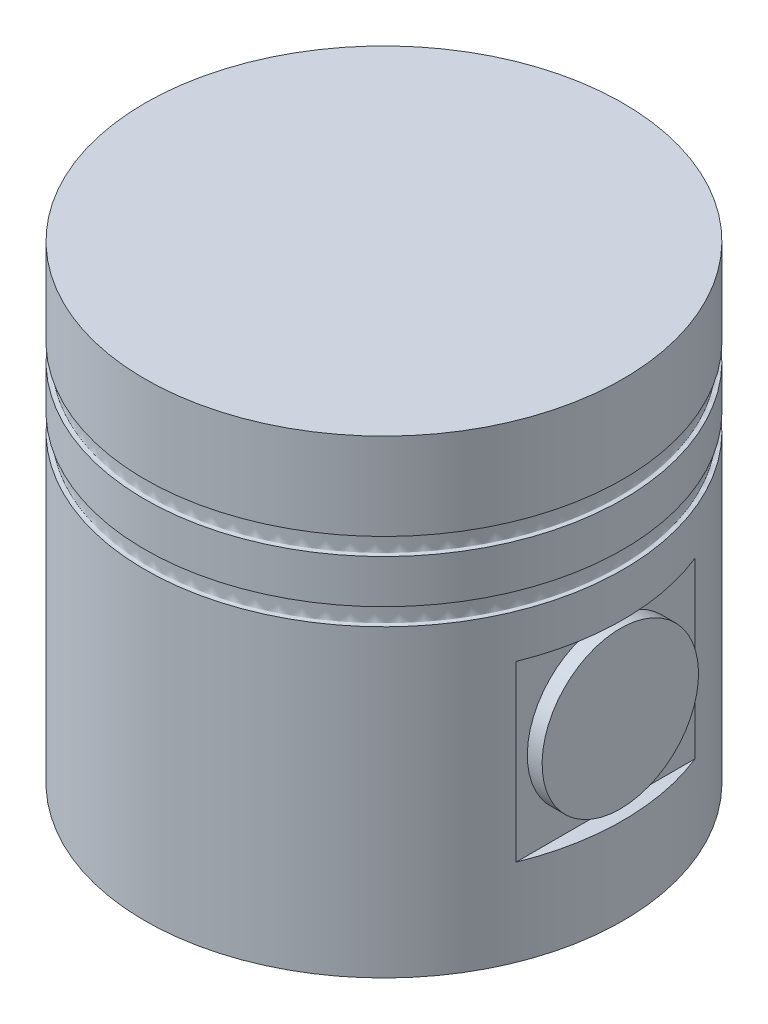
ISO-10303-21;
HEADER;
FILE_DESCRIPTION(('STEP AP214'),'2;1');
FILE_NAME('part.step','',(''),(''),'','','');
FILE_SCHEMA(('AUTOMOTIVE_DESIGN { 1 0 10303 214 1 1 1 1 }'));
ENDSEC;
DATA;
#1=APPLICATION_CONTEXT('core data for automotive mechanical design processes');
#2=APPLICATION_PROTOCOL_DEFINITION('international standard','automotive_design',2000,#1);
#3=PRODUCT_CONTEXT('',#1,'mechanical');
#4=PRODUCT('Part','Part','',(#3));
#5=PRODUCT_RELATED_PRODUCT_CATEGORY('part','',(#4));
#6=PRODUCT_DEFINITION_FORMATION('','',#4);
#7=PRODUCT_DEFINITION_CONTEXT('part definition',#1,'design');
#8=PRODUCT_DEFINITION('design','',#6,#7);
#9=PRODUCT_DEFINITION_SHAPE('','',#8);
#10=(LENGTH_UNIT() NAMED_UNIT(*) SI_UNIT(.MILLI.,.METRE.));
#11=(NAMED_UNIT(*) PLANE_ANGLE_UNIT() SI_UNIT($,.RADIAN.));
#12=(NAMED_UNIT(*) SI_UNIT($,.STERADIAN.) SOLID_ANGLE_UNIT());
#13=UNCERTAINTY_MEASURE_WITH_UNIT(LENGTH_MEASURE(1.E-05),#10,'distance_accuracy_value','');
#14=(GEOMETRIC_REPRESENTATION_CONTEXT(3) GLOBAL_UNCERTAINTY_ASSIGNED_CONTEXT((#13)) GLOBAL_UNIT_ASSIGNED_CONTEXT((#10,
#11,#12)) REPRESENTATION_CONTEXT('',''));
#15=CARTESIAN_POINT('',(0.,0.,0.));
#16=DIRECTION('',(0.,0.,1.));
#17=DIRECTION('',(1.,0.,0.));
#18=AXIS2_PLACEMENT_3D('',#15,#16,#17);
#19=CARTESIAN_POINT('',(27.2000000000001,20.,0.));
#20=DIRECTION('',(-1.,0.,0.));
#21=DIRECTION('',(0.,-1.,0.));
#22=AXIS2_PLACEMENT_3D('',#19,#20,#21);
#23=CYLINDRICAL_SURFACE('',#22,9.);
#24=CARTESIAN_POINT('',(27.2000000000001,20.,0.));
#25=DIRECTION('',(-1.,0.,0.));
#26=DIRECTION('',(0.,-1.,0.));
#27=AXIS2_PLACEMENT_3D('',#24,#25,#26);
#28=CIRCLE('',#27,9.);
#29=CARTESIAN_POINT('',(27.2000000000001,11.,0.));
#30=VERTEX_POINT('',#29);
#31=EDGE_CURVE('E11',#30,#30,#28,.T.);
#32=CARTESIAN_POINT('',(-27.1999999999999,20.,0.));
#33=DIRECTION('',(-1.,0.,0.));
#34=DIRECTION('',(0.,-1.,0.));
#35=AXIS2_PLACEMENT_3D('',#32,#33,#34);
#36=CIRCLE('',#35,9.);
#37=CARTESIAN_POINT('',(-27.1999999999999,11.,0.));
#38=VERTEX_POINT('',#37);
#39=EDGE_CURVE('E51',#38,#38,#36,.T.);
#40=CARTESIAN_POINT('',(27.2000000000001,11.,0.));
#41=CARTESIAN_POINT('',(26.6333333333335,11.,0.));
#42=CARTESIAN_POINT('',(26.0666666666668,11.,0.));
#43=CARTESIAN_POINT('',(24.9333333333335,11.,0.));
#44=CARTESIAN_POINT('',(24.3666666666668,11.,0.));
#45=CARTESIAN_POINT('',(23.2333333333335,11.,0.));
#46=CARTESIAN_POINT('',(22.6666666666668,11.,0.));
#47=CARTESIAN_POINT('',(21.5333333333335,11.,0.));
#48=CARTESIAN_POINT('',(20.9666666666668,11.,0.));
#49=CARTESIAN_POINT('',(19.8333333333335,11.,0.));
#50=CARTESIAN_POINT('',(19.2666666666668,11.,0.));
#51=CARTESIAN_POINT('',(18.1333333333335,11.,0.));
#52=CARTESIAN_POINT('',(17.5666666666668,11.,0.));
#53=CARTESIAN_POINT('',(16.4333333333335,11.,0.));
#54=CARTESIAN_POINT('',(15.8666666666668,11.,0.));
#55=CARTESIAN_POINT('',(14.7333333333335,11.,0.));
#56=CARTESIAN_POINT('',(14.1666666666668,11.,0.));
#57=CARTESIAN_POINT('',(13.0333333333335,11.,0.));
#58=CARTESIAN_POINT('',(12.4666666666668,11.,0.));
#59=CARTESIAN_POINT('',(11.3333333333335,11.,0.));
#60=CARTESIAN_POINT('',(10.7666666666668,11.,0.));
#61=CARTESIAN_POINT('',(9.63333333333347,11.,0.));
#62=CARTESIAN_POINT('',(9.0666666666668,11.,0.));
#63=CARTESIAN_POINT('',(7.93333333333347,11.,0.));
#64=CARTESIAN_POINT('',(7.3666666666668,11.,0.));
#65=CARTESIAN_POINT('',(6.23333333333347,11.,0.));
#66=CARTESIAN_POINT('',(5.6666666666668,11.,0.));
#67=CARTESIAN_POINT('',(4.53333333333347,11.,0.));
#68=CARTESIAN_POINT('',(3.9666666666668,11.,0.));
#69=CARTESIAN_POINT('',(2.83333333333347,11.,0.));
#70=CARTESIAN_POINT('',(2.2666666666668,11.,0.));
#71=CARTESIAN_POINT('',(1.13333333333347,11.,0.));
#72=CARTESIAN_POINT('',(0.566666666666802,11.,0.));
#73=CARTESIAN_POINT('',(-0.566666666666531,11.,0.));
#74=CARTESIAN_POINT('',(-1.1333333333332,11.,0.));
#75=CARTESIAN_POINT('',(-2.26666666666653,11.,0.));
#76=CARTESIAN_POINT('',(-2.8333333333332,11.,0.));
#77=CARTESIAN_POINT('',(-3.96666666666653,11.,0.));
#78=CARTESIAN_POINT('',(-4.5333333333332,11.,0.));
#79=CARTESIAN_POINT('',(-5.66666666666653,11.,0.));
#80=CARTESIAN_POINT('',(-6.23333333333319,11.,0.));
#81=CARTESIAN_POINT('',(-7.36666666666653,11.,0.));
#82=CARTESIAN_POINT('',(-7.9333333333332,11.,0.));
#83=CARTESIAN_POINT('',(-9.06666666666653,11.,0.));
#84=CARTESIAN_POINT('',(-9.6333333333332,11.,0.));
#85=CARTESIAN_POINT('',(-10.7666666666665,11.,0.));
#86=CARTESIAN_POINT('',(-11.3333333333332,11.,0.));
#87=CARTESIAN_POINT('',(-12.4666666666665,11.,0.));
#88=CARTESIAN_POINT('',(-13.0333333333332,11.,0.));
#89=CARTESIAN_POINT('',(-14.1666666666665,11.,0.));
#90=CARTESIAN_POINT('',(-14.7333333333332,11.,0.));
#91=CARTESIAN_POINT('',(-15.8666666666665,11.,0.));
#92=CARTESIAN_POINT('',(-16.4333333333332,11.,0.));
#93=CARTESIAN_POINT('',(-17.5666666666665,11.,0.));
#94=CARTESIAN_POINT('',(-18.1333333333332,11.,0.));
#95=CARTESIAN_POINT('',(-19.2666666666665,11.,0.));
#96=CARTESIAN_POINT('',(-19.8333333333332,11.,0.));
#97=CARTESIAN_POINT('',(-20.9666666666665,11.,0.));
#98=CARTESIAN_POINT('',(-21.5333333333332,11.,0.));
#99=CARTESIAN_POINT('',(-22.6666666666665,11.,0.));
#100=CARTESIAN_POINT('',(-23.2333333333332,11.,0.));
#101=CARTESIAN_POINT('',(-24.3666666666665,11.,0.));
#102=CARTESIAN_POINT('',(-24.9333333333332,11.,0.));
#103=CARTESIAN_POINT('',(-26.0666666666665,11.,0.));
#104=CARTESIAN_POINT('',(-26.6333333333332,11.,0.));
#105=CARTESIAN_POINT('',(-27.1999999999999,11.,0.));
#106=B_SPLINE_CURVE_WITH_KNOTS('',3,(#40,#41,#42,#43,#44,#45,#46,#47,#48,#49,#50,#51,#52,#53,
#54,#55,#56,#57,#58,#59,#60,#61,#62,#63,#64,#65,#66,#67,#68,#69,#70,#71,#72,#73,#74,#75,#76,#77,
#78,#79,#80,#81,#82,#83,#84,#85,#86,#87,#88,#89,#90,#91,#92,#93,#94,#95,#96,#97,#98,#99,#100,
#101,#102,#103,#104,#105),.UNSPECIFIED.,.F.,.F.,(4,2,2,2,2,2,2,2,2,2,2,2,2,2,2,2,2,2,2,2,2,2,2,
2,2,2,2,2,2,2,2,2,4),(0.,1.7,3.4,5.1,6.8,8.5,10.2,11.9,13.6,15.3,17.,18.7,20.4,22.1,23.8,25.5,
27.2,28.9,30.6,32.3,34.,35.7,37.4,39.1,40.8,42.5,44.2,45.9,47.6,49.3,51.,52.7,54.4),.UNSPECIFIED.);
#107=EDGE_CURVE('BSEAM45',#30,#38,#106,.T.);
#108=ORIENTED_EDGE('',*,*,#31,.T.);
#109=ORIENTED_EDGE('',*,*,#39,.F.);
#110=ORIENTED_EDGE('',*,*,#107,.T.);
#111=ORIENTED_EDGE('',*,*,#107,.F.);
#112=EDGE_LOOP('',(#108,#110,#109,#111));
#113=FACE_BOUND('',#112,.T.);
#114=ADVANCED_FACE('F45',(#113),#23,.T.);
#115=CARTESIAN_POINT('',(27.2000000000001,20.,0.));
#116=DIRECTION('',(-1.,0.,0.));
#117=DIRECTION('',(0.,-1.,0.));
#118=AXIS2_PLACEMENT_3D('',#115,#116,#117);
#119=PLANE('',#118);
#120=ORIENTED_EDGE('',*,*,#31,.F.);
#121=EDGE_LOOP('',(#120));
#122=FACE_BOUND('',#121,.T.);
#123=ADVANCED_FACE('F60',(#122),#119,.F.);
#124=CARTESIAN_POINT('',(-27.1999999999999,20.,0.));
#125=DIRECTION('',(-1.,0.,0.));
#126=DIRECTION('',(0.,-1.,0.));
#127=AXIS2_PLACEMENT_3D('',#124,#125,#126);
#128=PLANE('',#127);
#129=ORIENTED_EDGE('',*,*,#39,.T.);
#130=EDGE_LOOP('',(#129));
#131=FACE_BOUND('',#130,.T.);
#132=ADVANCED_FACE('F57',(#131),#128,.T.);
#133=CLOSED_SHELL('',(#114,#123,#132));
#134=MANIFOLD_SOLID_BREP('B2',#133);
#135=CARTESIAN_POINT('',(0.,54.,0.));
#136=DIRECTION('',(0.,1.,0.));
#137=DIRECTION('',(-1.,0.,0.));
#138=AXIS2_PLACEMENT_3D('',#135,#136,#137);
#139=CYLINDRICAL_SURFACE('',#138,27.4999999999999);
#140=CARTESIAN_POINT('',(1.20574084721109E-13,9.99999999999984,0.));
#141=DIRECTION('',(0.,-1.,0.));
#142=DIRECTION('',(0.,0.,-1.));
#143=AXIS2_PLACEMENT_3D('',#140,#141,#142);
#144=CIRCLE('',#143,27.4999999999999);
#145=CARTESIAN_POINT('',(25.5,9.99999999999984,-10.2956301409871));
#146=VERTEX_POINT('',#145);
#147=CARTESIAN_POINT('',(25.4999999999999,9.99999999999984,10.2956301409871));
#148=VERTEX_POINT('',#147);
#149=EDGE_CURVE('E133',#146,#148,#144,.T.);
#150=ORIENTED_EDGE('',*,*,#149,.T.);
#151=DIRECTION('',(0.,1.,0.));
#152=VECTOR('',#151,1.);
#153=CARTESIAN_POINT('',(25.4999999999998,54.,10.2956301409871));
#154=LINE('',#153,#152);
#155=CARTESIAN_POINT('',(25.4999999999999,30.,10.2956301409871));
#156=VERTEX_POINT('',#155);
#157=EDGE_CURVE('E43',#148,#156,#154,.T.);
#158=ORIENTED_EDGE('',*,*,#157,.T.);
#159=CARTESIAN_POINT('',(0.,30.,0.));
#160=DIRECTION('',(0.,1.,0.));
#161=DIRECTION('',(0.,0.,1.));
#162=AXIS2_PLACEMENT_3D('',#159,#160,#161);
#163=CIRCLE('',#162,27.4999999999999);
#164=CARTESIAN_POINT('',(25.4999999999999,30.,-10.2956301409871));
#165=VERTEX_POINT('',#164);
#166=EDGE_CURVE('E99',#156,#165,#163,.T.);
#167=ORIENTED_EDGE('',*,*,#166,.T.);
#168=DIRECTION('',(0.,1.,0.));
#169=VECTOR('',#168,1.);
#170=CARTESIAN_POINT('',(25.4999999999998,54.,-10.2956301409871));
#171=LINE('',#170,#169);
#172=EDGE_CURVE('E136',#165,#146,#171,.F.);
#173=ORIENTED_EDGE('',*,*,#172,.T.);
#174=EDGE_LOOP('',(#150,#158,#167,#173));
#175=FACE_BOUND('',#174,.T.);
#176=CARTESIAN_POINT('',(0.,34.9999999999999,0.));
#177=DIRECTION('',(0.,1.,0.));
#178=DIRECTION('',(-1.,0.,0.));
#179=AXIS2_PLACEMENT_3D('',#176,#177,#178);
#180=CIRCLE('',#179,27.4999999999999);
#181=CARTESIAN_POINT('',(-27.4999999999999,34.9999999999998,0.));
#182=VERTEX_POINT('',#181);
#183=EDGE_CURVE('E155',#182,#182,#180,.T.);
#184=ORIENTED_EDGE('',*,*,#183,.F.);
#185=EDGE_LOOP('',(#184));
#186=FACE_BOUND('',#185,.T.);
#187=CARTESIAN_POINT('',(1.49554307135885E-13,0.,0.));
#188=DIRECTION('',(0.,1.,0.));
#189=DIRECTION('',(-1.,0.,0.));
#190=AXIS2_PLACEMENT_3D('',#187,#188,#189);
#191=CIRCLE('',#190,27.4999999999999);
#192=CARTESIAN_POINT('',(-27.4999999999997,-1.56023444583614E-13,0.));
#193=VERTEX_POINT('',#192);
#194=EDGE_CURVE('E250',#193,#193,#191,.T.);
#195=ORIENTED_EDGE('',*,*,#194,.T.);
#196=EDGE_LOOP('',(#195));
#197=FACE_BOUND('',#196,.T.);
#198=CARTESIAN_POINT('',(1.20574084721109E-13,9.99999999999984,0.));
#199=DIRECTION('',(0.,1.,0.));
#200=DIRECTION('',(0.,0.,1.));
#201=AXIS2_PLACEMENT_3D('',#198,#199,#200);
#202=CIRCLE('',#201,27.4999999999999);
#203=CARTESIAN_POINT('',(-25.4999999999999,9.99999999999984,-10.2956301409868));
#204=VERTEX_POINT('',#203);
#205=CARTESIAN_POINT('',(-25.4999999999999,9.99999999999984,10.2956301409868));
#206=VERTEX_POINT('',#205);
#207=EDGE_CURVE('E257',#204,#206,#202,.T.);
#208=ORIENTED_EDGE('',*,*,#207,.F.);
#209=DIRECTION('',(0.,1.,0.));
#210=VECTOR('',#209,1.);
#211=CARTESIAN_POINT('',(-25.4999999999998,54.,-10.2956301409871));
#212=LINE('',#211,#210);
#213=CARTESIAN_POINT('',(-25.4999999999999,30.,-10.2956301409871));
#214=VERTEX_POINT('',#213);
#215=EDGE_CURVE('E268',#214,#204,#212,.F.);
#216=ORIENTED_EDGE('',*,*,#215,.F.);
#217=CARTESIAN_POINT('',(0.,30.,0.));
#218=DIRECTION('',(0.,-1.,0.));
#219=DIRECTION('',(0.,0.,-1.));
#220=AXIS2_PLACEMENT_3D('',#217,#218,#219);
#221=CIRCLE('',#220,27.4999999999999);
#222=CARTESIAN_POINT('',(-25.4999999999999,30.,10.2956301409871));
#223=VERTEX_POINT('',#222);
#224=EDGE_CURVE('E114',#223,#214,#221,.T.);
#225=ORIENTED_EDGE('',*,*,#224,.F.);
#226=DIRECTION('',(0.,1.,0.));
#227=VECTOR('',#226,1.);
#228=CARTESIAN_POINT('',(-25.4999999999998,54.,10.2956301409871));
#229=LINE('',#228,#227);
#230=EDGE_CURVE('E265',#206,#223,#229,.T.);
#231=ORIENTED_EDGE('',*,*,#230,.F.);
#232=EDGE_LOOP('',(#208,#216,#225,#231));
#233=FACE_BOUND('',#232,.T.);
#234=ADVANCED_FACE('F92',(#175,#186,#197,#233),#139,.T.);
#235=CARTESIAN_POINT('',(25.,0.,0.));
#236=DIRECTION('',(0.,1.,0.));
#237=DIRECTION('',(-1.,0.,0.));
#238=AXIS2_PLACEMENT_3D('',#235,#236,#237);
#239=PLANE('',#238);
#240=ORIENTED_EDGE('',*,*,#194,.F.);
#241=EDGE_LOOP('',(#240));
#242=FACE_BOUND('',#241,.T.);
#243=CARTESIAN_POINT('',(1.49554307135885E-13,0.,0.));
#244=DIRECTION('',(0.,1.,0.));
#245=DIRECTION('',(-1.,0.,0.));
#246=AXIS2_PLACEMENT_3D('',#243,#244,#245);
#247=CIRCLE('',#246,24.9999999999999);
#248=CARTESIAN_POINT('',(-24.9999999999997,-1.41839495076012E-13,0.));
#249=VERTEX_POINT('',#248);
#250=EDGE_CURVE('E253',#249,#249,#247,.T.);
#251=ORIENTED_EDGE('',*,*,#250,.T.);
#252=EDGE_LOOP('',(#251));
#253=FACE_BOUND('',#252,.T.);
#254=ADVANCED_FACE('F198',(#242,#253),#239,.F.);
#255=CARTESIAN_POINT('',(0.,54.,0.));
#256=DIRECTION('',(0.,1.,0.));
#257=DIRECTION('',(-1.,0.,0.));
#258=AXIS2_PLACEMENT_3D('',#255,#256,#257);
#259=CYLINDRICAL_SURFACE('',#258,24.9999999999999);
#260=CARTESIAN_POINT('',(-24.9999999999998,10.9999999999999,0.));
#261=CARTESIAN_POINT('',(-25.0000005117761,10.9999992842946,0.244377437478577));
#262=CARTESIAN_POINT('',(-24.9964088857301,11.0099611183273,0.488744560744714));
#263=CARTESIAN_POINT('',(-24.9821422235111,11.0497052454541,0.975642349155614));
#264=CARTESIAN_POINT('',(-24.9714675838943,11.0794864289237,1.21817311634353));
#265=CARTESIAN_POINT('',(-24.9433254149465,11.1585722327933,1.69960684398482));
#266=CARTESIAN_POINT('',(-24.9258583457289,11.2078755307861,1.93851004902744));
#267=CARTESIAN_POINT('',(-24.8845985577689,11.32553874289,2.41101671432108));
#268=CARTESIAN_POINT('',(-24.8608057178359,11.3938990221006,2.64462007294331));
#269=CARTESIAN_POINT('',(-24.8075749939919,11.5489018357606,3.10446312922977));
#270=CARTESIAN_POINT('',(-24.7781489296961,11.6355061282182,3.33071710480734));
#271=CARTESIAN_POINT('',(-24.7143620823206,11.8263970564885,3.77500972207617));
#272=CARTESIAN_POINT('',(-24.67999947121,11.9306902451941,3.99304528251751));
#273=CARTESIAN_POINT('',(-24.607211194798,12.1561348607635,4.41949682996967));
#274=CARTESIAN_POINT('',(-24.5687856108642,12.277285950036,4.6279130095041));
#275=CARTESIAN_POINT('',(-24.4888168439303,12.5356024545861,5.0339523067973));
#276=CARTESIAN_POINT('',(-24.4472734557301,12.6727689242559,5.2315747126762));
#277=CARTESIAN_POINT('',(-24.3605626607121,12.9673950563316,5.62177421180006));
#278=CARTESIAN_POINT('',(-24.3153188304336,13.1254042508408,5.81391953406979));
#279=CARTESIAN_POINT('',(-24.2237552565786,13.4566334141536,6.18434228906609));
#280=CARTESIAN_POINT('',(-24.1774354928564,13.6298536679365,6.36261946185464));
#281=CARTESIAN_POINT('',(-24.0849243691413,13.9905106572503,6.70430904349135));
#282=CARTESIAN_POINT('',(-24.0387330483391,14.1779513237712,6.86771731442816));
#283=CARTESIAN_POINT('',(-23.9477303325381,14.5659095601535,7.17861075377323));
#284=CARTESIAN_POINT('',(-23.9029189035803,14.7664268078216,7.32609631426294));
#285=CARTESIAN_POINT('',(-23.814392437232,15.1865910504612,7.60903758932205));
#286=CARTESIAN_POINT('',(-23.7707700380794,15.4066611899169,7.7438949154219));
#287=CARTESIAN_POINT('',(-23.6876809919573,15.8580898622584,7.99444762221296));
#288=CARTESIAN_POINT('',(-23.6482126903891,16.0894438465858,8.11015064276455));
#289=CARTESIAN_POINT('',(-23.5746816405145,16.5619679223338,8.32147286226203));
#290=CARTESIAN_POINT('',(-23.5406185125936,16.8031373229048,8.41709347178322));
#291=CARTESIAN_POINT('',(-23.4790444131725,17.2935837872616,8.58735589742448));
#292=CARTESIAN_POINT('',(-23.451533091187,17.5428604165446,8.66199883577206));
#293=CARTESIAN_POINT('',(-23.4049423381856,18.0379334786216,8.78709045177296));
#294=CARTESIAN_POINT('',(-23.3855799171568,18.2834965411671,8.8383574588723));
#295=CARTESIAN_POINT('',(-23.3544644390719,18.7785200656275,8.92025322951222));
#296=CARTESIAN_POINT('',(-23.342711200353,19.0279804343518,8.95088248576262));
#297=CARTESIAN_POINT('',(-23.3272256431548,19.5287576405994,8.99116296679227));
#298=CARTESIAN_POINT('',(-23.3234907486214,19.78007385585,9.00082092903203));
#299=CARTESIAN_POINT('',(-23.3241665366114,20.2826173753787,8.99906989869));
#300=CARTESIAN_POINT('',(-23.328576936867,20.5338446824361,8.98766163613915));
#301=CARTESIAN_POINT('',(-23.3449248114985,21.0204879653087,8.94510830522659));
#302=CARTESIAN_POINT('',(-23.3564370956875,21.2560167427962,8.91507766352911));
#303=CARTESIAN_POINT('',(-23.3862447167804,21.7236313932012,8.83658977903791));
#304=CARTESIAN_POINT('',(-23.4045424307482,21.9557160299035,8.7881260786433));
#305=CARTESIAN_POINT('',(-23.4473606049098,22.4147322377824,8.67323646674397));
#306=CARTESIAN_POINT('',(-23.471879351035,22.6416652096534,8.60681550263863));
#307=CARTESIAN_POINT('',(-23.5264353791932,23.0890928107551,8.45654912812247));
#308=CARTESIAN_POINT('',(-23.5564747662321,23.3095849468193,8.37269706967671));
#309=CARTESIAN_POINT('',(-23.6217915554838,23.7465349149683,8.18662627439073));
#310=CARTESIAN_POINT('',(-23.6571516364529,23.9628540222053,8.08411101499287));
#311=CARTESIAN_POINT('',(-23.7317357985147,24.386196961646,7.86246691503439));
#312=CARTESIAN_POINT('',(-23.7709611941586,24.5932175964522,7.74333241668722));
#313=CARTESIAN_POINT('',(-23.8522250838911,24.9967704777557,7.48926843600474));
#314=CARTESIAN_POINT('',(-23.8942638506635,25.1933017042472,7.35433742165191));
#315=CARTESIAN_POINT('',(-23.9800748214432,25.5748134181164,7.06952117138611));
#316=CARTESIAN_POINT('',(-24.0238470973783,25.7597934253816,6.9196353145649));
#317=CARTESIAN_POINT('',(-24.1147643326452,26.1282688825368,6.59606629323441));
#318=CARTESIAN_POINT('',(-24.1619505770673,26.3109664632965,6.42148498305642));
#319=CARTESIAN_POINT('',(-24.2557459345486,26.6610547934886,6.0575640399243));
#320=CARTESIAN_POINT('',(-24.3023552208186,26.8284502381697,5.86822896721284));
#321=CARTESIAN_POINT('',(-24.3937779994581,27.1470064849037,5.47578308299893));
#322=CARTESIAN_POINT('',(-24.4385905635276,27.2981589608828,5.27266529274265));
#323=CARTESIAN_POINT('',(-24.5251677094636,27.5830246013689,4.85405065063338));
#324=CARTESIAN_POINT('',(-24.5669335004741,27.7167447008637,4.63855877091741));
#325=CARTESIAN_POINT('',(-24.6468464937217,27.9675195189996,4.19342106944524));
#326=CARTESIAN_POINT('',(-24.684936068677,28.0843199124236,3.963621414987));
#327=CARTESIAN_POINT('',(-24.7557371275372,28.2979926865496,3.49424918756453));
#328=CARTESIAN_POINT('',(-24.7884508609803,28.3948734069881,3.2546807550259));
#329=CARTESIAN_POINT('',(-24.8475669642078,28.5678582556429,2.76742307602763));
#330=CARTESIAN_POINT('',(-24.8739700466889,28.6439647301478,2.51973475018872));
#331=CARTESIAN_POINT('',(-24.9196844085533,28.7746466957701,2.0181035010018));
#332=CARTESIAN_POINT('',(-24.9389960752705,28.8292233628598,1.76416092007048));
#333=CARTESIAN_POINT('',(-24.9691773704451,28.9141072513359,1.26476365209272));
#334=CARTESIAN_POINT('',(-24.9804182338023,28.9454840265,1.01951275503524));
#335=CARTESIAN_POINT('',(-24.995657820585,28.9879533961942,0.527038959819454));
#336=CARTESIAN_POINT('',(-24.9996567836917,28.9990466620367,0.279816127197224));
#337=CARTESIAN_POINT('',(-25.0003007727465,29.0008354388528,-0.214667411143433));
#338=CARTESIAN_POINT('',(-24.9969471068174,28.9915345781913,-0.4619281023003));
#339=CARTESIAN_POINT('',(-24.9829822616613,28.9526382831616,-0.954638282286296));
#340=CARTESIAN_POINT('',(-24.9723711781164,28.9230431163545,-1.20008779495097));
#341=CARTESIAN_POINT('',(-24.9446822623554,28.8452496090711,-1.67877449428671));
#342=CARTESIAN_POINT('',(-24.9278443331493,28.7977402632652,-1.91213804358545));
#343=CARTESIAN_POINT('',(-24.8881102342705,28.6845172986786,-2.37396397864614));
#344=CARTESIAN_POINT('',(-24.8652119235368,28.6187972458846,-2.60242460136368));
#345=CARTESIAN_POINT('',(-24.8139413213254,28.4697447371513,-3.05281481882596));
#346=CARTESIAN_POINT('',(-24.7855705713544,28.3864172403431,-3.27474623251185));
#347=CARTESIAN_POINT('',(-24.7240365414595,28.2027719038808,-3.71086780979239));
#348=CARTESIAN_POINT('',(-24.6908714453585,28.1024476230771,-3.92505500113621));
#349=CARTESIAN_POINT('',(-24.6195683039523,27.8825289624374,-4.35024362572807));
#350=CARTESIAN_POINT('',(-24.5813168936371,27.7624731312473,-4.56098733089174));
#351=CARTESIAN_POINT('',(-24.5015437971224,27.5060308421574,-4.97173454819627));
#352=CARTESIAN_POINT('',(-24.4600209875368,27.3696387660141,-5.17173433091392));
#353=CARTESIAN_POINT('',(-24.3747369500247,27.0814367238954,-5.55982740013606));
#354=CARTESIAN_POINT('',(-24.3309754375688,26.9296247956953,-5.74791916635193));
#355=CARTESIAN_POINT('',(-24.2422953214452,26.6115211021812,-6.11114351890216));
#356=CARTESIAN_POINT('',(-24.197376674087,26.4452287895562,-6.28627561494051));
#357=CARTESIAN_POINT('',(-24.1050842547312,26.0898344859501,-6.63163271164457));
#358=CARTESIAN_POINT('',(-24.0577079439896,25.8999876337351,-6.80109147968108));
#359=CARTESIAN_POINT('',(-23.9642463315422,25.5065057996768,-7.12341596435926));
#360=CARTESIAN_POINT('',(-23.9181606152075,25.3028753196374,-7.27628705656543));
#361=CARTESIAN_POINT('',(-23.8285670464007,24.8828991914297,-7.56453494293029));
#362=CARTESIAN_POINT('',(-23.7850604056211,24.6665476603001,-7.69990354885605));
#363=CARTESIAN_POINT('',(-23.7019665551913,24.2226440684085,-7.95200593287175));
#364=CARTESIAN_POINT('',(-23.6623777036101,23.9950967601305,-8.06874753014));
#365=CARTESIAN_POINT('',(-23.588260845007,23.5297184141064,-8.28292384744318));
#366=CARTESIAN_POINT('',(-23.5537431823805,23.2918676035633,-8.38031924295739));
#367=CARTESIAN_POINT('',(-23.4910136828166,22.8080626021745,-8.55458115540983));
#368=CARTESIAN_POINT('',(-23.4627990822514,22.5621120172304,-8.63145667234387));
#369=CARTESIAN_POINT('',(-23.4136335473776,22.0638944775027,-8.76394685605503));
#370=CARTESIAN_POINT('',(-23.3926808641221,21.8116290592865,-8.81956664235494));
#371=CARTESIAN_POINT('',(-23.3587814920076,21.3027300127337,-8.90896312104983));
#372=CARTESIAN_POINT('',(-23.3458343049382,21.0460966572509,-8.9427411727396));
#373=CARTESIAN_POINT('',(-23.328938530014,20.5459625761504,-8.98672016994919));
#374=CARTESIAN_POINT('',(-23.3244996864524,20.3025905838747,-8.9982061415285));
#375=CARTESIAN_POINT('',(-23.3232654615287,19.8157026871852,-9.0014051515669));
#376=CARTESIAN_POINT('',(-23.3264697625268,19.5721867891725,-8.99311901173103));
#377=CARTESIAN_POINT('',(-23.3404150541809,19.0868663457076,-8.95686320287646));
#378=CARTESIAN_POINT('',(-23.3511554452197,18.8450616656466,-8.92889509987402));
#379=CARTESIAN_POINT('',(-23.3798209519018,18.3649284736829,-8.85356381269982));
#380=CARTESIAN_POINT('',(-23.3977460749396,18.1265999653582,-8.80620060856646));
#381=CARTESIAN_POINT('',(-23.439652221103,17.6612846534834,-8.69403150190024));
#382=CARTESIAN_POINT('',(-23.4634625357799,17.4341642530876,-8.62971436762769));
#383=CARTESIAN_POINT('',(-23.5166662281179,16.9861853389643,-8.48365763596193));
#384=CARTESIAN_POINT('',(-23.5460615798713,16.7653290711817,-8.40191187697894));
#385=CARTESIAN_POINT('',(-23.6095982749143,16.3313198420757,-8.22167810159213));
#386=CARTESIAN_POINT('',(-23.643738761925,16.1181654996331,-8.12319310513821));
#387=CARTESIAN_POINT('',(-23.7158650685327,15.7006319610616,-7.91014482002666));
#388=CARTESIAN_POINT('',(-23.7538523755002,15.4962562029981,-7.79557530563496));
#389=CARTESIAN_POINT('',(-23.8346129278402,15.0876872040754,-7.54515508766401));
#390=CARTESIAN_POINT('',(-23.877529398596,14.8839921335095,-7.40853742417363));
#391=CARTESIAN_POINT('',(-23.9653551311282,14.4886093070828,-7.11931168971022));
#392=CARTESIAN_POINT('',(-24.0102652905633,14.2969270556198,-6.9666963728171));
#393=CARTESIAN_POINT('',(-24.1008798893617,13.9267284129255,-6.64644835852826));
#394=CARTESIAN_POINT('',(-24.1465843762798,13.7482128133332,-6.47881475950506));
#395=CARTESIAN_POINT('',(-24.2376088354721,13.4053809674456,-6.12950976244617));
#396=CARTESIAN_POINT('',(-24.2829288026074,13.2410649106527,-5.94783817712533));
#397=CARTESIAN_POINT('',(-24.3741989843985,12.9199994972981,-5.56233135041297));
#398=CARTESIAN_POINT('',(-24.4200729145817,12.7640051830074,-5.35784821112345));
#399=CARTESIAN_POINT('',(-24.5088377166433,12.4698749625774,-4.93592196575732));
#400=CARTESIAN_POINT('',(-24.5517297064589,12.3317323469266,-4.71848377395851));
#401=CARTESIAN_POINT('',(-24.633364359187,12.074247060322,-4.27187338036963));
#402=CARTESIAN_POINT('',(-24.6721053253465,11.9549120677699,-4.04269643644765));
#403=CARTESIAN_POINT('',(-24.7442969452733,11.7361697164884,-3.57433623037746));
#404=CARTESIAN_POINT('',(-24.7777498960689,11.6367537002298,-3.33515737031035));
#405=CARTESIAN_POINT('',(-24.8387340784812,11.4577595298757,-2.84582349866175));
#406=CARTESIAN_POINT('',(-24.8661987457106,11.3784029446291,-2.59557898249961));
#407=CARTESIAN_POINT('',(-24.9139158633208,11.2417290901545,-2.08845661851239));
#408=CARTESIAN_POINT('',(-24.9341681848555,11.1844122146569,-1.83157865227094));
#409=CARTESIAN_POINT('',(-24.9668256138288,11.0924621573607,-1.31338843661806));
#410=CARTESIAN_POINT('',(-24.979233393103,11.0578212520292,-1.05207772816133));
#411=CARTESIAN_POINT('',(-24.995820026308,11.0115913545754,-0.52717390767269));
#412=CARTESIAN_POINT('',(-24.9999994480074,11.0000007719464,-0.263580954379747));
#413=CARTESIAN_POINT('',(-24.9999999999998,10.9999999999999,0.));
#414=B_SPLINE_CURVE_WITH_KNOTS('',3,(#260,#261,#262,#263,#264,#265,#266,#267,#268,#269,#270,
#271,#272,#273,#274,#275,#276,#277,#278,#279,#280,#281,#282,#283,#284,#285,#286,#287,#288,#289,
#290,#291,#292,#293,#294,#295,#296,#297,#298,#299,#300,#301,#302,#303,#304,#305,#306,#307,#308,
#309,#310,#311,#312,#313,#314,#315,#316,#317,#318,#319,#320,#321,#322,#323,#324,#325,#326,#327,
#328,#329,#330,#331,#332,#333,#334,#335,#336,#337,#338,#339,#340,#341,#342,#343,#344,#345,#346,
#347,#348,#349,#350,#351,#352,#353,#354,#355,#356,#357,#358,#359,#360,#361,#362,#363,#364,#365,
#366,#367,#368,#369,#370,#371,#372,#373,#374,#375,#376,#377,#378,#379,#380,#381,#382,#383,#384,
#385,#386,#387,#388,#389,#390,#391,#392,#393,#394,#395,#396,#397,#398,#399,#400,#401,#402,#403,
#404,#405,#406,#407,#408,#409,#410,#411,#412,#413),.UNSPECIFIED.,.T.,.F.,(4,2,2,2,2,2,2,2,2,2,2,
2,2,2,2,2,2,2,2,2,2,2,2,2,2,2,2,2,2,2,2,2,2,2,2,2,2,2,2,2,2,2,2,2,2,2,2,2,2,2,2,2,2,2,2,2,2,2,2,
2,2,2,2,2,2,2,2,2,2,2,2,2,2,2,2,2,4),(0.,0.732886283584528,1.46573153856723,2.19852715988254,
2.93133682128087,3.66262542983543,4.39418554004951,5.12573100236405,5.85732465405187,
6.61502800722421,7.37274555900879,8.13067333745648,8.88858244840178,9.67290550065722,
10.4569149612015,11.240869335008,12.0247817621803,12.7786201711352,13.5324405821628,
14.2860187769898,15.039570857737,15.751878904412,16.4644367221214,17.1767984229855,
17.8894323111661,18.6145735707398,19.3399622996731,20.0654214384561,20.79091071003,
21.5612245037843,22.3313011384234,23.1017706466921,23.8719327035374,24.6526805047355,
25.4331007629526,26.2134328423005,26.9937222934942,27.7353070454591,28.4768672531505,
29.2182955388992,29.9597140498069,30.6751244836122,31.3907880016128,32.1062502212389,
32.8219841834444,33.5577871633432,34.2938439258406,35.0299944715016,35.7661728533142,
36.5418124111157,37.3171998520915,38.0929487420171,38.8683711292559,39.6453539210754,
40.4219953670523,41.1984496379427,41.9748555824584,42.70499505647,43.4351041872965,
44.1651552327831,44.8952070296469,45.6061586753171,46.3173620836986,47.02843731878,
47.7397885480597,48.4859438860112,49.2324386572946,49.978978274706,50.7255278536558,
51.5083341308613,52.2908453314466,53.073675177152,53.8561640342074,54.6469514493137,
55.4377529908559,56.2282850416452,57.018762542646),.UNSPECIFIED.);
#415=CARTESIAN_POINT('',(-24.9999999999998,10.9999999999999,0.));
#416=VERTEX_POINT('',#415);
#417=EDGE_CURVE('E149',#416,#416,#414,.T.);
#418=ORIENTED_EDGE('',*,*,#417,.T.);
#419=EDGE_LOOP('',(#418));
#420=FACE_BOUND('',#419,.T.);
#421=CARTESIAN_POINT('',(25.,11.,0.));
#422=CARTESIAN_POINT('',(25.0000005117763,10.9999992842946,-0.244377437478577));
#423=CARTESIAN_POINT('',(24.9964088857304,11.0099611183273,-0.488744560744714));
#424=CARTESIAN_POINT('',(24.9821422235113,11.0497052454542,-0.975642349155614));
#425=CARTESIAN_POINT('',(24.9714675838946,11.0794864289237,-1.21817311634353));
#426=CARTESIAN_POINT('',(24.9433254149468,11.1585722327933,-1.69960684398482));
#427=CARTESIAN_POINT('',(24.9258583457291,11.2078755307861,-1.93851004902744));
#428=CARTESIAN_POINT('',(24.8845985577691,11.32553874289,-2.41101671432107));
#429=CARTESIAN_POINT('',(24.8608057178361,11.3938990221006,-2.64462007294331));
#430=CARTESIAN_POINT('',(24.8075749939922,11.5489018357606,-3.10446312922976));
#431=CARTESIAN_POINT('',(24.7781489296963,11.6355061282182,-3.33071710480734));
#432=CARTESIAN_POINT('',(24.7143620823208,11.8263970564885,-3.77500972207616));
#433=CARTESIAN_POINT('',(24.6799994712102,11.9306902451942,-3.9930452825175));
#434=CARTESIAN_POINT('',(24.6072111947982,12.1561348607636,-4.41949682996966));
#435=CARTESIAN_POINT('',(24.5687856108644,12.277285950036,-4.6279130095041));
#436=CARTESIAN_POINT('',(24.4888168439305,12.5356024545861,-5.03395230679729));
#437=CARTESIAN_POINT('',(24.4472734557303,12.6727689242559,-5.23157471267619));
#438=CARTESIAN_POINT('',(24.3605626607123,12.9673950563316,-5.62177421180005));
#439=CARTESIAN_POINT('',(24.3153188304338,13.1254042508408,-5.81391953406978));
#440=CARTESIAN_POINT('',(24.2237552565788,13.4566334141536,-6.18434228906608));
#441=CARTESIAN_POINT('',(24.1774354928566,13.6298536679365,-6.36261946185463));
#442=CARTESIAN_POINT('',(24.0849243691415,13.9905106572503,-6.70430904349134));
#443=CARTESIAN_POINT('',(24.0387330483393,14.1779513237712,-6.86771731442815));
#444=CARTESIAN_POINT('',(23.9477303325383,14.5659095601535,-7.17861075377322));
#445=CARTESIAN_POINT('',(23.9029189035805,14.7664268078216,-7.32609631426293));
#446=CARTESIAN_POINT('',(23.8143924372322,15.1865910504612,-7.60903758932204));
#447=CARTESIAN_POINT('',(23.7707700380796,15.4066611899169,-7.74389491542189));
#448=CARTESIAN_POINT('',(23.6876809919576,15.8580898622584,-7.99444762221295));
#449=CARTESIAN_POINT('',(23.6482126903893,16.0894438465858,-8.11015064276454));
#450=CARTESIAN_POINT('',(23.5746816405147,16.5619679223338,-8.32147286226202));
#451=CARTESIAN_POINT('',(23.5406185125938,16.8031373229048,-8.41709347178321));
#452=CARTESIAN_POINT('',(23.4790444131727,17.2935837872616,-8.58735589742448));
#453=CARTESIAN_POINT('',(23.4515330911872,17.5428604165446,-8.66199883577205));
#454=CARTESIAN_POINT('',(23.4049423381858,18.0379334786216,-8.78709045177296));
#455=CARTESIAN_POINT('',(23.385579917157,18.2834965411671,-8.8383574588723));
#456=CARTESIAN_POINT('',(23.3544644390721,18.7785200656275,-8.92025322951222));
#457=CARTESIAN_POINT('',(23.3427112003532,19.0279804343518,-8.95088248576262));
#458=CARTESIAN_POINT('',(23.327225643155,19.5287576405994,-8.99116296679227));
#459=CARTESIAN_POINT('',(23.3234907486216,19.78007385585,-9.00082092903203));
#460=CARTESIAN_POINT('',(23.3241665366116,20.2826173753787,-8.99906989869));
#461=CARTESIAN_POINT('',(23.3285769368672,20.5338446824361,-8.98766163613915));
#462=CARTESIAN_POINT('',(23.3449248114987,21.0204879653087,-8.94510830522659));
#463=CARTESIAN_POINT('',(23.3564370956877,21.2560167427962,-8.91507766352911));
#464=CARTESIAN_POINT('',(23.3862447167806,21.7236313932012,-8.83658977903791));
#465=CARTESIAN_POINT('',(23.4045424307483,21.9557160299035,-8.7881260786433));
#466=CARTESIAN_POINT('',(23.44736060491,22.4147322377824,-8.67323646674398));
#467=CARTESIAN_POINT('',(23.4718793510351,22.6416652096534,-8.60681550263863));
#468=CARTESIAN_POINT('',(23.5264353791934,23.0890928107551,-8.45654912812247));
#469=CARTESIAN_POINT('',(23.5564747662322,23.3095849468193,-8.37269706967672));
#470=CARTESIAN_POINT('',(23.6217915554839,23.7465349149683,-8.18662627439073));
#471=CARTESIAN_POINT('',(23.6571516364531,23.9628540222054,-8.08411101499287));
#472=CARTESIAN_POINT('',(23.7317357985149,24.386196961646,-7.86246691503439));
#473=CARTESIAN_POINT('',(23.7709611941588,24.5932175964522,-7.74333241668722));
#474=CARTESIAN_POINT('',(23.8522250838913,24.9967704777557,-7.48926843600475));
#475=CARTESIAN_POINT('',(23.8942638506636,25.1933017042473,-7.35433742165192));
#476=CARTESIAN_POINT('',(23.9800748214433,25.5748134181164,-7.06952117138611));
#477=CARTESIAN_POINT('',(24.0238470973784,25.7597934253816,-6.9196353145649));
#478=CARTESIAN_POINT('',(24.1147643326454,26.1282688825368,-6.59606629323441));
#479=CARTESIAN_POINT('',(24.1619505770675,26.3109664632965,-6.42148498305642));
#480=CARTESIAN_POINT('',(24.2557459345488,26.6610547934886,-6.05756403992431));
#481=CARTESIAN_POINT('',(24.3023552208187,26.8284502381697,-5.86822896721284));
#482=CARTESIAN_POINT('',(24.3937779994582,27.1470064849037,-5.47578308299893));
#483=CARTESIAN_POINT('',(24.4385905635277,27.2981589608829,-5.27266529274265));
#484=CARTESIAN_POINT('',(24.5251677094637,27.5830246013689,-4.85405065063337));
#485=CARTESIAN_POINT('',(24.5669335004742,27.7167447008637,-4.6385587709174));
#486=CARTESIAN_POINT('',(24.6468464937219,27.9675195189996,-4.19342106944524));
#487=CARTESIAN_POINT('',(24.6849360686771,28.0843199124236,-3.963621414987));
#488=CARTESIAN_POINT('',(24.7557371275373,28.2979926865496,-3.49424918756453));
#489=CARTESIAN_POINT('',(24.7884508609805,28.3948734069881,-3.2546807550259));
#490=CARTESIAN_POINT('',(24.8475669642079,28.5678582556429,-2.76742307602763));
#491=CARTESIAN_POINT('',(24.873970046689,28.6439647301478,-2.51973475018873));
#492=CARTESIAN_POINT('',(24.9196844085535,28.7746466957702,-2.0181035010018));
#493=CARTESIAN_POINT('',(24.9389960752706,28.8292233628598,-1.76416092007049));
#494=CARTESIAN_POINT('',(24.9691773704452,28.914107251336,-1.26476365209272));
#495=CARTESIAN_POINT('',(24.9804182338025,28.9454840265,-1.01951275503525));
#496=CARTESIAN_POINT('',(24.9956578205852,28.9879533961942,-0.527038959819457));
#497=CARTESIAN_POINT('',(24.9996567836918,28.9990466620367,-0.279816127197226));
#498=CARTESIAN_POINT('',(25.0003007727466,29.0008354388528,0.214667411143431));
#499=CARTESIAN_POINT('',(24.9969471068175,28.9915345781914,0.461928102300298));
#500=CARTESIAN_POINT('',(24.9829822616614,28.9526382831616,0.954638282286292));
#501=CARTESIAN_POINT('',(24.9723711781165,28.9230431163545,1.20008779495097));
#502=CARTESIAN_POINT('',(24.9446822623555,28.8452496090711,1.67877449428671));
#503=CARTESIAN_POINT('',(24.9278443331495,28.7977402632652,1.91213804358545));
#504=CARTESIAN_POINT('',(24.8881102342707,28.6845172986786,2.37396397864613));
#505=CARTESIAN_POINT('',(24.8652119235369,28.6187972458846,2.60242460136367));
#506=CARTESIAN_POINT('',(24.8139413213256,28.4697447371513,3.05281481882595));
#507=CARTESIAN_POINT('',(24.7855705713545,28.3864172403431,3.27474623251184));
#508=CARTESIAN_POINT('',(24.7240365414597,28.2027719038808,3.71086780979238));
#509=CARTESIAN_POINT('',(24.6908714453586,28.1024476230771,3.92505500113621));
#510=CARTESIAN_POINT('',(24.6195683039525,27.8825289624374,4.35024362572806));
#511=CARTESIAN_POINT('',(24.5813168936372,27.7624731312473,4.56098733089174));
#512=CARTESIAN_POINT('',(24.5015437971226,27.5060308421574,4.97173454819627));
#513=CARTESIAN_POINT('',(24.460020987537,27.3696387660141,5.17173433091391));
#514=CARTESIAN_POINT('',(24.3747369500249,27.0814367238954,5.55982740013605));
#515=CARTESIAN_POINT('',(24.3309754375689,26.9296247956953,5.74791916635192));
#516=CARTESIAN_POINT('',(24.2422953214454,26.6115211021812,6.11114351890216));
#517=CARTESIAN_POINT('',(24.1973766740871,26.4452287895562,6.28627561494051));
#518=CARTESIAN_POINT('',(24.1050842547313,26.0898344859501,6.63163271164456));
#519=CARTESIAN_POINT('',(24.0577079439897,25.8999876337352,6.80109147968108));
#520=CARTESIAN_POINT('',(23.9642463315424,25.5065057996769,7.12341596435926));
#521=CARTESIAN_POINT('',(23.9181606152076,25.3028753196374,7.27628705656543));
#522=CARTESIAN_POINT('',(23.8285670464008,24.8828991914298,7.56453494293028));
#523=CARTESIAN_POINT('',(23.7850604056213,24.6665476603002,7.69990354885605));
#524=CARTESIAN_POINT('',(23.7019665551915,24.2226440684085,7.95200593287174));
#525=CARTESIAN_POINT('',(23.6623777036103,23.9950967601305,8.06874753013999));
#526=CARTESIAN_POINT('',(23.5882608450072,23.5297184141064,8.28292384744317));
#527=CARTESIAN_POINT('',(23.5537431823807,23.2918676035633,8.38031924295738));
#528=CARTESIAN_POINT('',(23.4910136828167,22.8080626021745,8.55458115540983));
#529=CARTESIAN_POINT('',(23.4627990822516,22.5621120172304,8.63145667234387));
#530=CARTESIAN_POINT('',(23.4136335473778,22.0638944775027,8.76394685605503));
#531=CARTESIAN_POINT('',(23.3926808641223,21.8116290592865,8.81956664235494));
#532=CARTESIAN_POINT('',(23.3587814920078,21.3027300127337,8.90896312104983));
#533=CARTESIAN_POINT('',(23.3458343049384,21.046096657251,8.9427411727396));
#534=CARTESIAN_POINT('',(23.3289385300141,20.5459625761505,8.98672016994919));
#535=CARTESIAN_POINT('',(23.3244996864526,20.3025905838748,8.9982061415285));
#536=CARTESIAN_POINT('',(23.3232654615289,19.8157026871853,9.0014051515669));
#537=CARTESIAN_POINT('',(23.326469762527,19.5721867891725,8.99311901173103));
#538=CARTESIAN_POINT('',(23.3404150541811,19.0868663457076,8.95686320287646));
#539=CARTESIAN_POINT('',(23.3511554452199,18.8450616656466,8.92889509987402));
#540=CARTESIAN_POINT('',(23.379820951902,18.3649284736829,8.85356381269983));
#541=CARTESIAN_POINT('',(23.3977460749398,18.1265999653582,8.80620060856646));
#542=CARTESIAN_POINT('',(23.4396522211032,17.6612846534835,8.69403150190024));
#543=CARTESIAN_POINT('',(23.4634625357801,17.4341642530877,8.62971436762769));
#544=CARTESIAN_POINT('',(23.5166662281181,16.9861853389643,8.48365763596193));
#545=CARTESIAN_POINT('',(23.5460615798715,16.7653290711817,8.40191187697894));
#546=CARTESIAN_POINT('',(23.6095982749145,16.3313198420757,8.22167810159213));
#547=CARTESIAN_POINT('',(23.6437387619252,16.1181654996332,8.12319310513821));
#548=CARTESIAN_POINT('',(23.7158650685329,15.7006319610616,7.91014482002666));
#549=CARTESIAN_POINT('',(23.7538523755004,15.4962562029981,7.79557530563496));
#550=CARTESIAN_POINT('',(23.8346129278404,15.0876872040754,7.54515508766401));
#551=CARTESIAN_POINT('',(23.8775293985963,14.8839921335095,7.40853742417363));
#552=CARTESIAN_POINT('',(23.9653551311284,14.4886093070828,7.11931168971022));
#553=CARTESIAN_POINT('',(24.0102652905635,14.2969270556198,6.9666963728171));
#554=CARTESIAN_POINT('',(24.1008798893619,13.9267284129255,6.64644835852826));
#555=CARTESIAN_POINT('',(24.14658437628,13.7482128133332,6.47881475950506));
#556=CARTESIAN_POINT('',(24.2376088354723,13.4053809674456,6.12950976244617));
#557=CARTESIAN_POINT('',(24.2829288026076,13.2410649106528,5.94783817712532));
#558=CARTESIAN_POINT('',(24.3741989843987,12.9199994972981,5.56233135041297));
#559=CARTESIAN_POINT('',(24.4200729145819,12.7640051830074,5.35784821112345));
#560=CARTESIAN_POINT('',(24.5088377166435,12.4698749625774,4.93592196575732));
#561=CARTESIAN_POINT('',(24.5517297064591,12.3317323469266,4.71848377395851));
#562=CARTESIAN_POINT('',(24.6333643591872,12.074247060322,4.27187338036963));
#563=CARTESIAN_POINT('',(24.6721053253467,11.9549120677699,4.04269643644765));
#564=CARTESIAN_POINT('',(24.7442969452735,11.7361697164884,3.57433623037746));
#565=CARTESIAN_POINT('',(24.7777498960691,11.6367537002298,3.33515737031034));
#566=CARTESIAN_POINT('',(24.8387340784814,11.4577595298757,2.84582349866174));
#567=CARTESIAN_POINT('',(24.8661987457109,11.3784029446291,2.5955789824996));
#568=CARTESIAN_POINT('',(24.913915863321,11.2417290901545,2.08845661851238));
#569=CARTESIAN_POINT('',(24.9341681848557,11.1844122146569,1.83157865227093));
#570=CARTESIAN_POINT('',(24.966825613829,11.0924621573608,1.31338843661806));
#571=CARTESIAN_POINT('',(24.9792333931033,11.0578212520292,1.05207772816133));
#572=CARTESIAN_POINT('',(24.9958200263082,11.0115913545755,0.527173907672691));
#573=CARTESIAN_POINT('',(24.9999994480077,11.0000007719464,0.263580954379747));
#574=CARTESIAN_POINT('',(25.,11.,0.));
#575=B_SPLINE_CURVE_WITH_KNOTS('',3,(#421,#422,#423,#424,#425,#426,#427,#428,#429,#430,#431,
#432,#433,#434,#435,#436,#437,#438,#439,#440,#441,#442,#443,#444,#445,#446,#447,#448,#449,#450,
#451,#452,#453,#454,#455,#456,#457,#458,#459,#460,#461,#462,#463,#464,#465,#466,#467,#468,#469,
#470,#471,#472,#473,#474,#475,#476,#477,#478,#479,#480,#481,#482,#483,#484,#485,#486,#487,#488,
#489,#490,#491,#492,#493,#494,#495,#496,#497,#498,#499,#500,#501,#502,#503,#504,#505,#506,#507,
#508,#509,#510,#511,#512,#513,#514,#515,#516,#517,#518,#519,#520,#521,#522,#523,#524,#525,#526,
#527,#528,#529,#530,#531,#532,#533,#534,#535,#536,#537,#538,#539,#540,#541,#542,#543,#544,#545,
#546,#547,#548,#549,#550,#551,#552,#553,#554,#555,#556,#557,#558,#559,#560,#561,#562,#563,#564,
#565,#566,#567,#568,#569,#570,#571,#572,#573,#574),.UNSPECIFIED.,.T.,.F.,(4,2,2,2,2,2,2,2,2,2,2,
2,2,2,2,2,2,2,2,2,2,2,2,2,2,2,2,2,2,2,2,2,2,2,2,2,2,2,2,2,2,2,2,2,2,2,2,2,2,2,2,2,2,2,2,2,2,2,2,
2,2,2,2,2,2,2,2,2,2,2,2,2,2,2,2,2,4),(0.,0.732886283584528,1.46573153856723,2.19852715988254,
2.93133682128086,3.66262542983542,4.39418554004951,5.12573100236404,5.85732465405186,
6.6150280072242,7.37274555900878,8.13067333745647,8.88858244840177,9.6729055006572,
10.4569149612015,11.240869335008,12.0247817621803,12.7786201711351,13.5324405821628,
14.2860187769898,15.039570857737,15.7518789044119,16.4644367221214,17.1767984229855,
17.8894323111661,18.6145735707398,19.3399622996731,20.0654214384561,20.79091071003,
21.5612245037843,22.3313011384234,23.1017706466921,23.8719327035374,24.6526805047355,
25.4331007629526,26.2134328423005,26.9937222934941,27.7353070454591,28.4768672531505,
29.2182955388992,29.9597140498069,30.6751244836122,31.3907880016127,32.1062502212389,
32.8219841834444,33.5577871633432,34.2938439258406,35.0299944715016,35.7661728533141,
36.5418124111156,37.3171998520914,38.0929487420171,38.8683711292558,39.6453539210754,
40.4219953670523,41.1984496379427,41.9748555824583,42.70499505647,43.4351041872965,
44.1651552327831,44.8952070296469,45.6061586753171,46.3173620836986,47.02843731878,
47.7397885480597,48.4859438860112,49.2324386572946,49.978978274706,50.7255278536558,
51.5083341308613,52.2908453314466,53.073675177152,53.8561640342074,54.6469514493137,
55.4377529908559,56.2282850416452,57.018762542646),.UNSPECIFIED.);
#576=CARTESIAN_POINT('',(25.,11.,0.));
#577=VERTEX_POINT('',#576);
#578=EDGE_CURVE('E202',#577,#577,#575,.T.);
#579=ORIENTED_EDGE('',*,*,#578,.T.);
#580=EDGE_LOOP('',(#579));
#581=FACE_BOUND('',#580,.T.);
#582=ORIENTED_EDGE('',*,*,#250,.F.);
#583=EDGE_LOOP('',(#582));
#584=FACE_BOUND('',#583,.T.);
#585=CARTESIAN_POINT('',(0.,51.4999999999999,0.));
#586=DIRECTION('',(0.,1.,0.));
#587=DIRECTION('',(-1.,0.,0.));
#588=AXIS2_PLACEMENT_3D('',#585,#586,#587);
#589=CIRCLE('',#588,25.);
#590=CARTESIAN_POINT('',(-25.,51.4999999999999,0.));
#591=VERTEX_POINT('',#590);
#592=EDGE_CURVE('E255',#591,#591,#589,.T.);
#593=ORIENTED_EDGE('',*,*,#592,.T.);
#594=EDGE_LOOP('',(#593));
#595=FACE_BOUND('',#594,.T.);
#596=ADVANCED_FACE('F194',(#420,#581,#584,#595),#259,.F.);
#597=CARTESIAN_POINT('',(0.,51.5,0.));
#598=DIRECTION('',(0.,1.,0.));
#599=DIRECTION('',(-1.,0.,0.));
#600=AXIS2_PLACEMENT_3D('',#597,#598,#599);
#601=PLANE('',#600);
#602=ORIENTED_EDGE('',*,*,#592,.F.);
#603=EDGE_LOOP('',(#602));
#604=FACE_BOUND('',#603,.T.);
#605=ADVANCED_FACE('F190',(#604),#601,.F.);
#606=CARTESIAN_POINT('',(27.5,54.,0.));
#607=DIRECTION('',(0.,-1.,0.));
#608=DIRECTION('',(1.,0.,0.));
#609=AXIS2_PLACEMENT_3D('',#606,#607,#608);
#610=PLANE('',#609);
#611=CARTESIAN_POINT('',(0.,53.9999999999999,0.));
#612=DIRECTION('',(0.,1.,0.));
#613=DIRECTION('',(-1.,0.,0.));
#614=AXIS2_PLACEMENT_3D('',#611,#612,#613);
#615=CIRCLE('',#614,27.5);
#616=CARTESIAN_POINT('',(-27.5,53.9999999999999,0.));
#617=VERTEX_POINT('',#616);
#618=EDGE_CURVE('E260',#617,#617,#615,.T.);
#619=ORIENTED_EDGE('',*,*,#618,.T.);
#620=EDGE_LOOP('',(#619));
#621=FACE_BOUND('',#620,.T.);
#622=ADVANCED_FACE('F186',(#621),#610,.F.);
#623=CARTESIAN_POINT('',(0.,54.,0.));
#624=DIRECTION('',(0.,1.,0.));
#625=DIRECTION('',(-1.,0.,0.));
#626=AXIS2_PLACEMENT_3D('',#623,#624,#625);
#627=CYLINDRICAL_SURFACE('',#626,27.5);
#628=ORIENTED_EDGE('',*,*,#618,.F.);
#629=EDGE_LOOP('',(#628));
#630=FACE_BOUND('',#629,.T.);
#631=CARTESIAN_POINT('',(0.,43.9999999999999,0.));
#632=DIRECTION('',(0.,1.,0.));
#633=DIRECTION('',(-1.,0.,0.));
#634=AXIS2_PLACEMENT_3D('',#631,#632,#633);
#635=CIRCLE('',#634,27.5);
#636=CARTESIAN_POINT('',(-27.5,43.9999999999999,0.));
#637=VERTEX_POINT('',#636);
#638=EDGE_CURVE('E275',#637,#637,#635,.T.);
#639=ORIENTED_EDGE('',*,*,#638,.T.);
#640=EDGE_LOOP('',(#639));
#641=FACE_BOUND('',#640,.T.);
#642=ADVANCED_FACE('F182',(#630,#641),#627,.T.);
#643=CARTESIAN_POINT('',(27.5,42.,0.));
#644=CARTESIAN_POINT('',(27.3415019542349,42.,0.));
#645=CARTESIAN_POINT('',(27.1791531836482,42.,0.));
#646=CARTESIAN_POINT('',(27.0129536882398,42.,0.));
#647=CARTESIAN_POINT('',(27.,42.0129536882398,0.));
#648=CARTESIAN_POINT('',(27.0000000000001,42.6709845627466,0.));
#649=CARTESIAN_POINT('',(27.0000000000001,43.3290154372535,0.));
#650=CARTESIAN_POINT('',(27.,43.9870463117602,0.));
#651=CARTESIAN_POINT('',(27.0129536882398,44.,0.));
#652=CARTESIAN_POINT('',(27.1791531836483,44.0000000000001,0.));
#653=CARTESIAN_POINT('',(27.3415019542349,44.,0.));
#654=CARTESIAN_POINT('',(27.5,44.,0.));
#655=B_SPLINE_CURVE_WITH_KNOTS('',3,(#643,#644,#645,#646,#647,#648,#649,#650,#651,#652,#653,
#654),.UNSPECIFIED.,.F.,.F.,(4,1,1,1,1,1,1,1,1,4),(0.,0.160029550111861,0.163917482974603,
0.167805415837345,0.171693348700087,0.828306651299767,0.832194584162509,0.836082517025251,
0.839970449887993,1.),.UNSPECIFIED.);
#656=CARTESIAN_POINT('',(0.,54.,0.));
#657=DIRECTION('',(0.,1.,0.));
#658=AXIS1_PLACEMENT('',#656,#657);
#659=SURFACE_OF_REVOLUTION('',#655,#658);
#660=ORIENTED_EDGE('',*,*,#638,.F.);
#661=EDGE_LOOP('',(#660));
#662=FACE_BOUND('',#661,.T.);
#663=CARTESIAN_POINT('',(0.,41.9999999999999,0.));
#664=DIRECTION('',(0.,1.,0.));
#665=DIRECTION('',(-1.,0.,0.));
#666=AXIS2_PLACEMENT_3D('',#663,#664,#665);
#667=CIRCLE('',#666,27.5);
#668=CARTESIAN_POINT('',(-27.4999999999999,41.9999999999999,0.));
#669=VERTEX_POINT('',#668);
#670=EDGE_CURVE('E278',#669,#669,#667,.T.);
#671=ORIENTED_EDGE('',*,*,#670,.T.);
#672=EDGE_LOOP('',(#671));
#673=FACE_BOUND('',#672,.T.);
#674=ADVANCED_FACE('F178',(#662,#673),#659,.T.);
#675=CARTESIAN_POINT('',(0.,54.,0.));
#676=DIRECTION('',(0.,1.,0.));
#677=DIRECTION('',(-1.,0.,0.));
#678=AXIS2_PLACEMENT_3D('',#675,#676,#677);
#679=CYLINDRICAL_SURFACE('',#678,27.5);
#680=ORIENTED_EDGE('',*,*,#670,.F.);
#681=EDGE_LOOP('',(#680));
#682=FACE_BOUND('',#681,.T.);
#683=CARTESIAN_POINT('',(0.,36.9999999999999,0.));
#684=DIRECTION('',(0.,1.,0.));
#685=DIRECTION('',(-1.,0.,0.));
#686=AXIS2_PLACEMENT_3D('',#683,#684,#685);
#687=CIRCLE('',#686,27.5);
#688=CARTESIAN_POINT('',(-27.4999999999999,36.9999999999998,0.));
#689=VERTEX_POINT('',#688);
#690=EDGE_CURVE('E281',#689,#689,#687,.T.);
#691=ORIENTED_EDGE('',*,*,#690,.T.);
#692=EDGE_LOOP('',(#691));
#693=FACE_BOUND('',#692,.T.);
#694=ADVANCED_FACE('F173',(#682,#693),#679,.T.);
#695=CARTESIAN_POINT('',(27.5,35.,0.));
#696=CARTESIAN_POINT('',(27.3415019542349,35.,0.));
#697=CARTESIAN_POINT('',(27.1791531836481,35.,0.));
#698=CARTESIAN_POINT('',(27.0129536882398,35.,0.));
#699=CARTESIAN_POINT('',(27.,35.0129536882398,0.));
#700=CARTESIAN_POINT('',(27.0000000000001,35.670984562747,0.));
#701=CARTESIAN_POINT('',(26.9999999999998,36.3290154372535,0.));
#702=CARTESIAN_POINT('',(27.,36.9870463117602,0.));
#703=CARTESIAN_POINT('',(27.0129536882398,37.,0.));
#704=CARTESIAN_POINT('',(27.1791531836482,37.,0.));
#705=CARTESIAN_POINT('',(27.3415019542349,37.,0.));
#706=CARTESIAN_POINT('',(27.5,37.,0.));
#707=B_SPLINE_CURVE_WITH_KNOTS('',3,(#695,#696,#697,#698,#699,#700,#701,#702,#703,#704,#705,
#706),.UNSPECIFIED.,.F.,.F.,(4,1,1,1,1,1,1,1,1,4),(0.,0.16002955011186,0.163917482974602,
0.167805415837344,0.171693348700086,0.828306651299769,0.832194584162512,0.836082517025254,
0.839970449887996,1.),.UNSPECIFIED.);
#708=CARTESIAN_POINT('',(0.,54.,0.));
#709=DIRECTION('',(0.,1.,0.));
#710=AXIS1_PLACEMENT('',#708,#709);
#711=SURFACE_OF_REVOLUTION('',#707,#710);
#712=ORIENTED_EDGE('',*,*,#690,.F.);
#713=EDGE_LOOP('',(#712));
#714=FACE_BOUND('',#713,.T.);
#715=ORIENTED_EDGE('',*,*,#183,.T.);
#716=EDGE_LOOP('',(#715));
#717=FACE_BOUND('',#716,.T.);
#718=ADVANCED_FACE('F168',(#714,#717),#711,.T.);
#719=CARTESIAN_POINT('',(-27.4999999999999,30.,-27.5));
#720=DIRECTION('',(0.,-1.,0.));
#721=DIRECTION('',(0.,0.,-1.));
#722=AXIS2_PLACEMENT_3D('',#719,#720,#721);
#723=PLANE('',#722);
#724=DIRECTION('',(0.,0.,1.));
#725=VECTOR('',#724,1.);
#726=CARTESIAN_POINT('',(-25.4999999999999,30.,-27.5));
#727=LINE('',#726,#725);
#728=EDGE_CURVE('E147',#214,#223,#727,.T.);
#729=ORIENTED_EDGE('',*,*,#728,.T.);
#730=ORIENTED_EDGE('',*,*,#224,.T.);
#731=EDGE_LOOP('',(#729,#730));
#732=FACE_BOUND('',#731,.T.);
#733=ADVANCED_FACE('F172',(#732),#723,.T.);
#734=CARTESIAN_POINT('',(-25.4999999999999,30.,-27.5));
#735=DIRECTION('',(-1.,0.,0.));
#736=DIRECTION('',(0.,-1.,0.));
#737=AXIS2_PLACEMENT_3D('',#734,#735,#736);
#738=PLANE('',#737);
#739=CARTESIAN_POINT('',(-25.4999999999999,20.,0.));
#740=DIRECTION('',(-1.,0.,0.));
#741=DIRECTION('',(0.,-1.,0.));
#742=AXIS2_PLACEMENT_3D('',#739,#740,#741);
#743=CIRCLE('',#742,9.);
#744=CARTESIAN_POINT('',(-25.4999999999999,11.,0.));
#745=VERTEX_POINT('',#744);
#746=EDGE_CURVE('E435',#745,#745,#743,.T.);
#747=ORIENTED_EDGE('',*,*,#746,.F.);
#748=EDGE_LOOP('',(#747));
#749=FACE_BOUND('',#748,.T.);
#750=ORIENTED_EDGE('',*,*,#230,.T.);
#751=ORIENTED_EDGE('',*,*,#728,.F.);
#752=ORIENTED_EDGE('',*,*,#215,.T.);
#753=DIRECTION('',(0.,0.,1.));
#754=VECTOR('',#753,1.);
#755=CARTESIAN_POINT('',(-25.4999999999999,9.99999999999984,-27.5));
#756=LINE('',#755,#754);
#757=EDGE_CURVE('E144',#204,#206,#756,.T.);
#758=ORIENTED_EDGE('',*,*,#757,.T.);
#759=EDGE_LOOP('',(#750,#751,#752,#758));
#760=FACE_BOUND('',#759,.T.);
#761=ADVANCED_FACE('F230',(#749,#760),#738,.T.);
#762=CARTESIAN_POINT('',(-25.4999999999999,9.99999999999984,-27.5));
#763=DIRECTION('',(0.,1.,0.));
#764=DIRECTION('',(0.,0.,1.));
#765=AXIS2_PLACEMENT_3D('',#762,#763,#764);
#766=PLANE('',#765);
#767=ORIENTED_EDGE('',*,*,#757,.F.);
#768=ORIENTED_EDGE('',*,*,#207,.T.);
#769=EDGE_LOOP('',(#767,#768));
#770=FACE_BOUND('',#769,.T.);
#771=ADVANCED_FACE('F227',(#770),#766,.T.);
#772=CARTESIAN_POINT('',(27.4999999999999,30.,-27.5));
#773=DIRECTION('',(0.,1.,0.));
#774=DIRECTION('',(0.,0.,1.));
#775=AXIS2_PLACEMENT_3D('',#772,#773,#774);
#776=PLANE('',#775);
#777=DIRECTION('',(0.,0.,1.));
#778=VECTOR('',#777,1.);
#779=CARTESIAN_POINT('',(25.4999999999999,30.,-27.5));
#780=LINE('',#779,#778);
#781=EDGE_CURVE('E142',#165,#156,#780,.T.);
#782=ORIENTED_EDGE('',*,*,#781,.F.);
#783=ORIENTED_EDGE('',*,*,#166,.F.);
#784=EDGE_LOOP('',(#782,#783));
#785=FACE_BOUND('',#784,.T.);
#786=ADVANCED_FACE('F224',(#785),#776,.F.);
#787=CARTESIAN_POINT('',(25.4999999999999,9.99999999999984,-27.5));
#788=DIRECTION('',(0.,-1.,0.));
#789=DIRECTION('',(0.,0.,-1.));
#790=AXIS2_PLACEMENT_3D('',#787,#788,#789);
#791=PLANE('',#790);
#792=DIRECTION('',(0.,0.,1.));
#793=VECTOR('',#792,1.);
#794=CARTESIAN_POINT('',(25.4999999999999,9.99999999999984,-27.5));
#795=LINE('',#794,#793);
#796=EDGE_CURVE('E106',#146,#148,#795,.T.);
#797=ORIENTED_EDGE('',*,*,#796,.T.);
#798=ORIENTED_EDGE('',*,*,#149,.F.);
#799=EDGE_LOOP('',(#797,#798));
#800=FACE_BOUND('',#799,.T.);
#801=ADVANCED_FACE('F143',(#800),#791,.F.);
#802=CARTESIAN_POINT('',(25.4999999999999,30.,-27.5));
#803=DIRECTION('',(-1.,0.,0.));
#804=DIRECTION('',(0.,-1.,0.));
#805=AXIS2_PLACEMENT_3D('',#802,#803,#804);
#806=PLANE('',#805);
#807=CARTESIAN_POINT('',(25.4999999999999,20.,0.));
#808=DIRECTION('',(-1.,0.,0.));
#809=DIRECTION('',(0.,-1.,0.));
#810=AXIS2_PLACEMENT_3D('',#807,#808,#809);
#811=CIRCLE('',#810,9.);
#812=CARTESIAN_POINT('',(25.4999999999999,11.,0.));
#813=VERTEX_POINT('',#812);
#814=EDGE_CURVE('E431',#813,#813,#811,.F.);
#815=ORIENTED_EDGE('',*,*,#814,.F.);
#816=EDGE_LOOP('',(#815));
#817=FACE_BOUND('',#816,.T.);
#818=ORIENTED_EDGE('',*,*,#796,.F.);
#819=ORIENTED_EDGE('',*,*,#172,.F.);
#820=ORIENTED_EDGE('',*,*,#781,.T.);
#821=ORIENTED_EDGE('',*,*,#157,.F.);
#822=EDGE_LOOP('',(#818,#819,#820,#821));
#823=FACE_BOUND('',#822,.T.);
#824=ADVANCED_FACE('F140',(#817,#823),#806,.F.);
#825=CARTESIAN_POINT('',(50.9558441227156,20.,0.));
#826=DIRECTION('',(-1.,0.,0.));
#827=DIRECTION('',(0.,-1.,0.));
#828=AXIS2_PLACEMENT_3D('',#825,#826,#827);
#829=CYLINDRICAL_SURFACE('',#828,9.);
#830=ORIENTED_EDGE('',*,*,#814,.T.);
#831=EDGE_LOOP('',(#830));
#832=FACE_BOUND('',#831,.T.);
#833=ORIENTED_EDGE('',*,*,#578,.F.);
#834=EDGE_LOOP('',(#833));
#835=FACE_BOUND('',#834,.T.);
#836=ADVANCED_FACE('F216',(#832,#835),#829,.F.);
#837=ORIENTED_EDGE('',*,*,#746,.T.);
#838=EDGE_LOOP('',(#837));
#839=FACE_BOUND('',#838,.T.);
#840=ORIENTED_EDGE('',*,*,#417,.F.);
#841=EDGE_LOOP('',(#840));
#842=FACE_BOUND('',#841,.T.);
#843=ADVANCED_FACE('F212',(#839,#842),#829,.F.);
#844=CLOSED_SHELL('',(#234,#254,#596,#605,#622,#642,#674,#694,#718,#733,#761,#771,#786,#801,
#824,#836,#843));
#845=MANIFOLD_SOLID_BREP('B6',#844);
#846=ADVANCED_BREP_SHAPE_REPRESENTATION('',(#18,#134,#845),#14);
#847=SHAPE_DEFINITION_REPRESENTATION(#9,#846);
ENDSEC;
END-ISO-10303-21;
